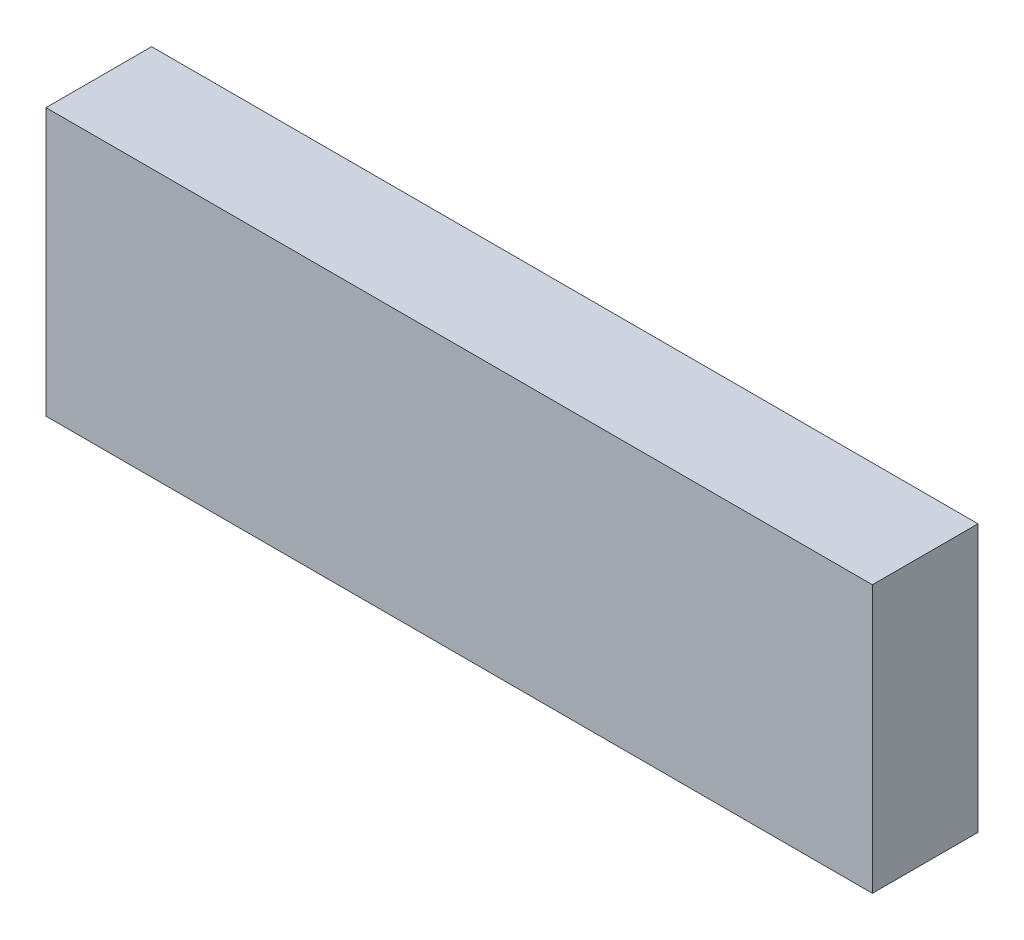
ISO-10303-21;
HEADER;
FILE_DESCRIPTION(('STEP AP214'),'2;1');
FILE_NAME('part.step','',(''),(''),'','','');
FILE_SCHEMA(('AUTOMOTIVE_DESIGN { 1 0 10303 214 1 1 1 1 }'));
ENDSEC;
DATA;
#1=APPLICATION_CONTEXT('core data for automotive mechanical design processes');
#2=APPLICATION_PROTOCOL_DEFINITION('international standard','automotive_design',2000,#1);
#3=PRODUCT_CONTEXT('',#1,'mechanical');
#4=PRODUCT('Part','Part','',(#3));
#5=PRODUCT_RELATED_PRODUCT_CATEGORY('part','',(#4));
#6=PRODUCT_DEFINITION_FORMATION('','',#4);
#7=PRODUCT_DEFINITION_CONTEXT('part definition',#1,'design');
#8=PRODUCT_DEFINITION('design','',#6,#7);
#9=PRODUCT_DEFINITION_SHAPE('','',#8);
#10=(LENGTH_UNIT() NAMED_UNIT(*) SI_UNIT(.MILLI.,.METRE.));
#11=(NAMED_UNIT(*) PLANE_ANGLE_UNIT() SI_UNIT($,.RADIAN.));
#12=(NAMED_UNIT(*) SI_UNIT($,.STERADIAN.) SOLID_ANGLE_UNIT());
#13=UNCERTAINTY_MEASURE_WITH_UNIT(LENGTH_MEASURE(1.E-05),#10,'distance_accuracy_value','');
#14=(GEOMETRIC_REPRESENTATION_CONTEXT(3) GLOBAL_UNCERTAINTY_ASSIGNED_CONTEXT((#13)) GLOBAL_UNIT_ASSIGNED_CONTEXT((#10,
#11,#12)) REPRESENTATION_CONTEXT('',''));
#15=CARTESIAN_POINT('',(0.,0.,0.));
#16=DIRECTION('',(0.,0.,1.));
#17=DIRECTION('',(1.,0.,0.));
#18=AXIS2_PLACEMENT_3D('',#15,#16,#17);
#19=CARTESIAN_POINT('',(-32.9108578169867,-46.2817431928003,-1.6));
#20=DIRECTION('',(0.,0.,1.));
#21=DIRECTION('',(1.,0.,0.));
#22=AXIS2_PLACEMENT_3D('',#19,#20,#21);
#23=PLANE('',#22);
#24=DIRECTION('',(1.,0.,0.));
#25=VECTOR('',#24,1.);
#26=CARTESIAN_POINT('',(-56.7775104323587,-38.5634863856006,-1.6));
#27=LINE('',#26,#25);
#28=CARTESIAN_POINT('',(-56.7775104323587,-38.5634863856006,-1.6));
#29=VERTEX_POINT('',#28);
#30=CARTESIAN_POINT('',(-9.04420520161464,-38.5634863856006,-1.6));
#31=VERTEX_POINT('',#30);
#32=EDGE_CURVE('E55',#29,#31,#27,.T.);
#33=ORIENTED_EDGE('',*,*,#32,.F.);
#34=DIRECTION('',(0.,1.,0.));
#35=VECTOR('',#34,1.);
#36=CARTESIAN_POINT('',(-56.7775104323587,-54.,-1.6));
#37=LINE('',#36,#35);
#38=CARTESIAN_POINT('',(-56.7775104323587,-54.,-1.6));
#39=VERTEX_POINT('',#38);
#40=EDGE_CURVE('E57',#39,#29,#37,.T.);
#41=ORIENTED_EDGE('',*,*,#40,.F.);
#42=DIRECTION('',(1.,0.,0.));
#43=VECTOR('',#42,1.);
#44=CARTESIAN_POINT('',(-9.04420520161464,-54.,-1.6));
#45=LINE('',#44,#43);
#46=CARTESIAN_POINT('',(-9.04420520161464,-54.,-1.6));
#47=VERTEX_POINT('',#46);
#48=EDGE_CURVE('E20',#47,#39,#45,.F.);
#49=ORIENTED_EDGE('',*,*,#48,.F.);
#50=DIRECTION('',(0.,1.,0.));
#51=VECTOR('',#50,1.);
#52=CARTESIAN_POINT('',(-9.04420520161464,-38.5634863856006,-1.6));
#53=LINE('',#52,#51);
#54=EDGE_CURVE('E79',#31,#47,#53,.F.);
#55=ORIENTED_EDGE('',*,*,#54,.F.);
#56=EDGE_LOOP('',(#33,#41,#49,#55));
#57=FACE_BOUND('',#56,.T.);
#58=ADVANCED_FACE('F17',(#57),#23,.T.);
#59=CARTESIAN_POINT('',(-9.04420520161464,-54.,-1.6));
#60=DIRECTION('',(0.,-1.,0.));
#61=DIRECTION('',(0.,0.,-1.));
#62=AXIS2_PLACEMENT_3D('',#59,#60,#61);
#63=PLANE('',#62);
#64=DIRECTION('',(-1.,0.,0.));
#65=VECTOR('',#64,1.);
#66=CARTESIAN_POINT('',(-32.9108578169867,-54.,-7.7));
#67=LINE('',#66,#65);
#68=CARTESIAN_POINT('',(-9.04420520161464,-54.,-7.7));
#69=VERTEX_POINT('',#68);
#70=CARTESIAN_POINT('',(-56.7775104323587,-54.,-7.7));
#71=VERTEX_POINT('',#70);
#72=EDGE_CURVE('E83',#69,#71,#67,.T.);
#73=ORIENTED_EDGE('',*,*,#72,.F.);
#74=DIRECTION('',(0.,0.,-1.));
#75=VECTOR('',#74,1.);
#76=CARTESIAN_POINT('',(-9.04420520161464,-54.,-1.6));
#77=LINE('',#76,#75);
#78=EDGE_CURVE('E68',#47,#69,#77,.T.);
#79=ORIENTED_EDGE('',*,*,#78,.F.);
#80=ORIENTED_EDGE('',*,*,#48,.T.);
#81=DIRECTION('',(0.,0.,1.));
#82=VECTOR('',#81,1.);
#83=CARTESIAN_POINT('',(-56.7775104323587,-54.,-1.6));
#84=LINE('',#83,#82);
#85=EDGE_CURVE('E63',#71,#39,#84,.T.);
#86=ORIENTED_EDGE('',*,*,#85,.F.);
#87=EDGE_LOOP('',(#73,#79,#80,#86));
#88=FACE_BOUND('',#87,.T.);
#89=ADVANCED_FACE('F65',(#88),#63,.T.);
#90=CARTESIAN_POINT('',(-56.7775104323587,-54.,-1.6));
#91=DIRECTION('',(-1.,0.,0.));
#92=DIRECTION('',(0.,0.,1.));
#93=AXIS2_PLACEMENT_3D('',#90,#91,#92);
#94=PLANE('',#93);
#95=DIRECTION('',(0.,1.,0.));
#96=VECTOR('',#95,1.);
#97=CARTESIAN_POINT('',(-56.7775104323587,-46.2817431928003,-7.7));
#98=LINE('',#97,#96);
#99=CARTESIAN_POINT('',(-56.7775104323587,-38.5634863856006,-7.7));
#100=VERTEX_POINT('',#99);
#101=EDGE_CURVE('E72',#71,#100,#98,.T.);
#102=ORIENTED_EDGE('',*,*,#101,.F.);
#103=ORIENTED_EDGE('',*,*,#85,.T.);
#104=ORIENTED_EDGE('',*,*,#40,.T.);
#105=DIRECTION('',(0.,0.,1.));
#106=VECTOR('',#105,1.);
#107=CARTESIAN_POINT('',(-56.7775104323587,-38.5634863856006,-1.6));
#108=LINE('',#107,#106);
#109=EDGE_CURVE('E75',#100,#29,#108,.T.);
#110=ORIENTED_EDGE('',*,*,#109,.F.);
#111=EDGE_LOOP('',(#102,#103,#104,#110));
#112=FACE_BOUND('',#111,.T.);
#113=ADVANCED_FACE('F70',(#112),#94,.T.);
#114=CARTESIAN_POINT('',(-56.7775104323587,-38.5634863856006,-1.6));
#115=DIRECTION('',(0.,1.,0.));
#116=DIRECTION('',(0.,0.,1.));
#117=AXIS2_PLACEMENT_3D('',#114,#115,#116);
#118=PLANE('',#117);
#119=DIRECTION('',(-1.,0.,0.));
#120=VECTOR('',#119,1.);
#121=CARTESIAN_POINT('',(-32.9108578169867,-38.5634863856006,-7.7));
#122=LINE('',#121,#120);
#123=CARTESIAN_POINT('',(-9.04420520161464,-38.5634863856006,-7.7));
#124=VERTEX_POINT('',#123);
#125=EDGE_CURVE('E26',#100,#124,#122,.F.);
#126=ORIENTED_EDGE('',*,*,#125,.F.);
#127=ORIENTED_EDGE('',*,*,#109,.T.);
#128=ORIENTED_EDGE('',*,*,#32,.T.);
#129=DIRECTION('',(0.,0.,-1.));
#130=VECTOR('',#129,1.);
#131=CARTESIAN_POINT('',(-9.04420520161464,-38.5634863856006,-1.6));
#132=LINE('',#131,#130);
#133=EDGE_CURVE('E35',#124,#31,#132,.F.);
#134=ORIENTED_EDGE('',*,*,#133,.F.);
#135=EDGE_LOOP('',(#126,#127,#128,#134));
#136=FACE_BOUND('',#135,.T.);
#137=ADVANCED_FACE('F89',(#136),#118,.T.);
#138=CARTESIAN_POINT('',(-9.04420520161464,-38.5634863856006,-1.6));
#139=DIRECTION('',(1.,0.,0.));
#140=DIRECTION('',(0.,0.,-1.));
#141=AXIS2_PLACEMENT_3D('',#138,#139,#140);
#142=PLANE('',#141);
#143=DIRECTION('',(0.,1.,0.));
#144=VECTOR('',#143,1.);
#145=CARTESIAN_POINT('',(-9.04420520161464,-46.2817431928003,-7.7));
#146=LINE('',#145,#144);
#147=EDGE_CURVE('E11',#124,#69,#146,.F.);
#148=ORIENTED_EDGE('',*,*,#147,.F.);
#149=ORIENTED_EDGE('',*,*,#133,.T.);
#150=ORIENTED_EDGE('',*,*,#54,.T.);
#151=ORIENTED_EDGE('',*,*,#78,.T.);
#152=EDGE_LOOP('',(#148,#149,#150,#151));
#153=FACE_BOUND('',#152,.T.);
#154=ADVANCED_FACE('F91',(#153),#142,.T.);
#155=CARTESIAN_POINT('',(-32.9108578169867,-46.2817431928003,-7.7));
#156=DIRECTION('',(0.,0.,-1.));
#157=DIRECTION('',(-1.,0.,0.));
#158=AXIS2_PLACEMENT_3D('',#155,#156,#157);
#159=PLANE('',#158);
#160=ORIENTED_EDGE('',*,*,#125,.T.);
#161=ORIENTED_EDGE('',*,*,#147,.T.);
#162=ORIENTED_EDGE('',*,*,#72,.T.);
#163=ORIENTED_EDGE('',*,*,#101,.T.);
#164=EDGE_LOOP('',(#160,#161,#162,#163));
#165=FACE_BOUND('',#164,.T.);
#166=ADVANCED_FACE('F88',(#165),#159,.T.);
#167=CLOSED_SHELL('',(#58,#89,#113,#137,#154,#166));
#168=MANIFOLD_SOLID_BREP('B1',#167);
#169=ADVANCED_BREP_SHAPE_REPRESENTATION('',(#18,#168),#14);
#170=SHAPE_DEFINITION_REPRESENTATION(#9,#169);
ENDSEC;
END-ISO-10303-21;
